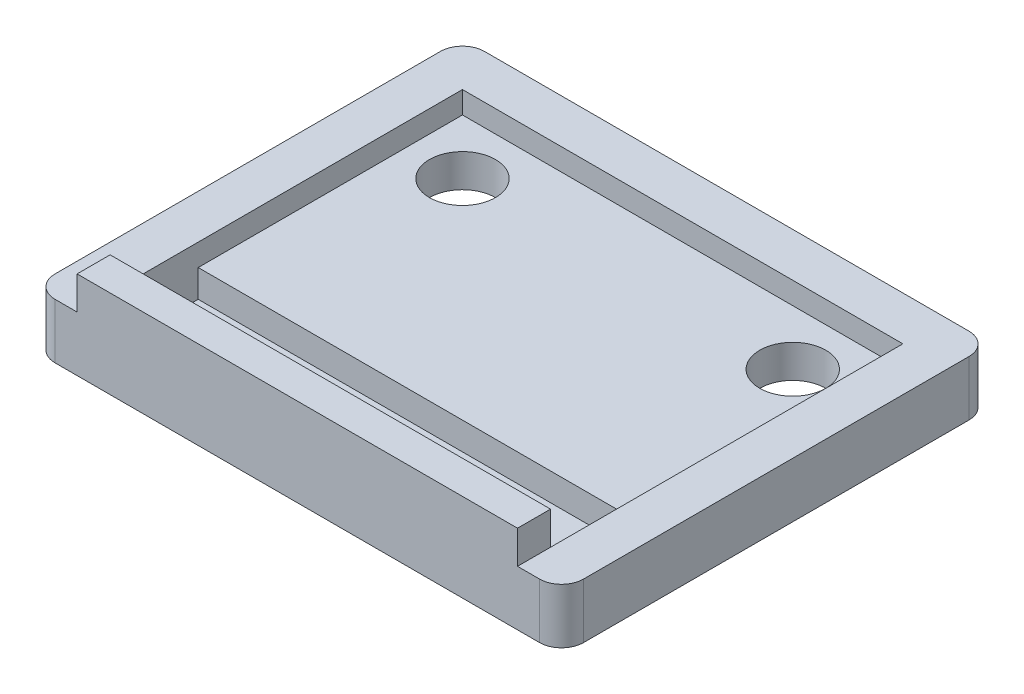
ISO-10303-21;
HEADER;
FILE_DESCRIPTION(('STEP AP214'),'2;1');
FILE_NAME('part.step','',(''),(''),'','','');
FILE_SCHEMA(('AUTOMOTIVE_DESIGN { 1 0 10303 214 1 1 1 1 }'));
ENDSEC;
DATA;
#1=APPLICATION_CONTEXT('core data for automotive mechanical design processes');
#2=APPLICATION_PROTOCOL_DEFINITION('international standard','automotive_design',2000,#1);
#3=PRODUCT_CONTEXT('',#1,'mechanical');
#4=PRODUCT('Part','Part','',(#3));
#5=PRODUCT_RELATED_PRODUCT_CATEGORY('part','',(#4));
#6=PRODUCT_DEFINITION_FORMATION('','',#4);
#7=PRODUCT_DEFINITION_CONTEXT('part definition',#1,'design');
#8=PRODUCT_DEFINITION('design','',#6,#7);
#9=PRODUCT_DEFINITION_SHAPE('','',#8);
#10=(LENGTH_UNIT() NAMED_UNIT(*) SI_UNIT(.MILLI.,.METRE.));
#11=(NAMED_UNIT(*) PLANE_ANGLE_UNIT() SI_UNIT($,.RADIAN.));
#12=(NAMED_UNIT(*) SI_UNIT($,.STERADIAN.) SOLID_ANGLE_UNIT());
#13=UNCERTAINTY_MEASURE_WITH_UNIT(LENGTH_MEASURE(1.E-05),#10,'distance_accuracy_value','');
#14=(GEOMETRIC_REPRESENTATION_CONTEXT(3) GLOBAL_UNCERTAINTY_ASSIGNED_CONTEXT((#13)) GLOBAL_UNIT_ASSIGNED_CONTEXT((#10,
#11,#12)) REPRESENTATION_CONTEXT('',''));
#15=CARTESIAN_POINT('',(0.,0.,0.));
#16=DIRECTION('',(0.,0.,1.));
#17=DIRECTION('',(1.,0.,0.));
#18=AXIS2_PLACEMENT_3D('',#15,#16,#17);
#19=CARTESIAN_POINT('',(22.,4.,0.));
#20=DIRECTION('',(1.,0.,0.));
#21=DIRECTION('',(0.,0.,-1.));
#22=AXIS2_PLACEMENT_3D('',#19,#20,#21);
#23=PLANE('',#22);
#24=DIRECTION('',(0.,0.,-1.));
#25=VECTOR('',#24,1.);
#26=CARTESIAN_POINT('',(22.,2.5,0.));
#27=LINE('',#26,#25);
#28=CARTESIAN_POINT('',(22.,2.5,0.));
#29=VERTEX_POINT('',#28);
#30=CARTESIAN_POINT('',(22.,2.5,-1.5));
#31=VERTEX_POINT('',#30);
#32=EDGE_CURVE('E220',#29,#31,#27,.T.);
#33=ORIENTED_EDGE('',*,*,#32,.T.);
#34=DIRECTION('',(0.,-1.,0.));
#35=VECTOR('',#34,1.);
#36=CARTESIAN_POINT('',(22.,4.,-1.5));
#37=LINE('',#36,#35);
#38=CARTESIAN_POINT('',(22.,4.,-1.5));
#39=VERTEX_POINT('',#38);
#40=EDGE_CURVE('E11',#39,#31,#37,.T.);
#41=ORIENTED_EDGE('',*,*,#40,.F.);
#42=DIRECTION('',(0.,0.,1.));
#43=VECTOR('',#42,1.);
#44=CARTESIAN_POINT('',(22.,4.,0.));
#45=LINE('',#44,#43);
#46=CARTESIAN_POINT('',(22.,4.,0.));
#47=VERTEX_POINT('',#46);
#48=EDGE_CURVE('E280',#39,#47,#45,.T.);
#49=ORIENTED_EDGE('',*,*,#48,.T.);
#50=DIRECTION('',(0.,-1.,0.));
#51=VECTOR('',#50,1.);
#52=CARTESIAN_POINT('',(22.,4.,0.));
#53=LINE('',#52,#51);
#54=EDGE_CURVE('E290',#47,#29,#53,.T.);
#55=ORIENTED_EDGE('',*,*,#54,.T.);
#56=EDGE_LOOP('',(#33,#41,#49,#55));
#57=FACE_BOUND('',#56,.T.);
#58=ADVANCED_FACE('F37',(#57),#23,.T.);
#59=CARTESIAN_POINT('',(0.,4.,-1.5));
#60=DIRECTION('',(0.,0.,-1.));
#61=DIRECTION('',(-1.,0.,0.));
#62=AXIS2_PLACEMENT_3D('',#59,#60,#61);
#63=PLANE('',#62);
#64=DIRECTION('',(1.,0.,0.));
#65=VECTOR('',#64,1.);
#66=CARTESIAN_POINT('',(0.,0.25,-1.5));
#67=LINE('',#66,#65);
#68=CARTESIAN_POINT('',(2.,0.25,-1.5));
#69=VERTEX_POINT('',#68);
#70=CARTESIAN_POINT('',(22.,0.25,-1.5));
#71=VERTEX_POINT('',#70);
#72=EDGE_CURVE('E171',#69,#71,#67,.T.);
#73=ORIENTED_EDGE('',*,*,#72,.F.);
#74=DIRECTION('',(0.,-1.,0.));
#75=VECTOR('',#74,1.);
#76=CARTESIAN_POINT('',(2.,4.,-1.5));
#77=LINE('',#76,#75);
#78=CARTESIAN_POINT('',(2.,2.5,-1.5));
#79=VERTEX_POINT('',#78);
#80=EDGE_CURVE('E277',#79,#69,#77,.T.);
#81=ORIENTED_EDGE('',*,*,#80,.F.);
#82=DIRECTION('',(0.,-1.,0.));
#83=VECTOR('',#82,1.);
#84=CARTESIAN_POINT('',(2.,4.,-1.5));
#85=LINE('',#84,#83);
#86=CARTESIAN_POINT('',(2.,4.,-1.5));
#87=VERTEX_POINT('',#86);
#88=EDGE_CURVE('E44',#87,#79,#85,.T.);
#89=ORIENTED_EDGE('',*,*,#88,.F.);
#90=DIRECTION('',(1.,0.,0.));
#91=VECTOR('',#90,1.);
#92=CARTESIAN_POINT('',(0.,4.,-1.5));
#93=LINE('',#92,#91);
#94=EDGE_CURVE('E283',#87,#39,#93,.T.);
#95=ORIENTED_EDGE('',*,*,#94,.T.);
#96=ORIENTED_EDGE('',*,*,#40,.T.);
#97=DIRECTION('',(0.,1.,0.));
#98=VECTOR('',#97,1.);
#99=CARTESIAN_POINT('',(22.,4.,-1.5));
#100=LINE('',#99,#98);
#101=EDGE_CURVE('E275',#71,#31,#100,.T.);
#102=ORIENTED_EDGE('',*,*,#101,.F.);
#103=EDGE_LOOP('',(#73,#81,#89,#95,#96,#102));
#104=FACE_BOUND('',#103,.T.);
#105=ADVANCED_FACE('F322',(#104),#63,.T.);
#106=CARTESIAN_POINT('',(2.,4.,0.));
#107=DIRECTION('',(1.,0.,0.));
#108=DIRECTION('',(0.,0.,-1.));
#109=AXIS2_PLACEMENT_3D('',#106,#107,#108);
#110=PLANE('',#109);
#111=ORIENTED_EDGE('',*,*,#88,.T.);
#112=DIRECTION('',(0.,0.,1.));
#113=VECTOR('',#112,1.);
#114=CARTESIAN_POINT('',(2.,2.5,0.));
#115=LINE('',#114,#113);
#116=CARTESIAN_POINT('',(2.,2.5,0.));
#117=VERTEX_POINT('',#116);
#118=EDGE_CURVE('E211',#79,#117,#115,.T.);
#119=ORIENTED_EDGE('',*,*,#118,.T.);
#120=DIRECTION('',(0.,-1.,0.));
#121=VECTOR('',#120,1.);
#122=CARTESIAN_POINT('',(2.,4.,0.));
#123=LINE('',#122,#121);
#124=CARTESIAN_POINT('',(2.,4.,0.));
#125=VERTEX_POINT('',#124);
#126=EDGE_CURVE('E294',#125,#117,#123,.T.);
#127=ORIENTED_EDGE('',*,*,#126,.F.);
#128=DIRECTION('',(0.,0.,1.));
#129=VECTOR('',#128,1.);
#130=CARTESIAN_POINT('',(2.,4.,0.));
#131=LINE('',#130,#129);
#132=EDGE_CURVE('E286',#87,#125,#131,.T.);
#133=ORIENTED_EDGE('',*,*,#132,.F.);
#134=EDGE_LOOP('',(#111,#119,#127,#133));
#135=FACE_BOUND('',#134,.T.);
#136=ADVANCED_FACE('F300',(#135),#110,.F.);
#137=CARTESIAN_POINT('',(0.,4.,0.));
#138=DIRECTION('',(0.,0.,-1.));
#139=DIRECTION('',(-1.,0.,0.));
#140=AXIS2_PLACEMENT_3D('',#137,#138,#139);
#141=PLANE('',#140);
#142=DIRECTION('',(1.,0.,0.));
#143=VECTOR('',#142,1.);
#144=CARTESIAN_POINT('',(0.,0.,0.));
#145=LINE('',#144,#143);
#146=CARTESIAN_POINT('',(1.00000000000001,0.,0.));
#147=VERTEX_POINT('',#146);
#148=CARTESIAN_POINT('',(23.,0.,0.));
#149=VERTEX_POINT('',#148);
#150=EDGE_CURVE('E279',#147,#149,#145,.T.);
#151=ORIENTED_EDGE('',*,*,#150,.T.);
#152=DIRECTION('',(0.,-1.,0.));
#153=VECTOR('',#152,1.);
#154=CARTESIAN_POINT('',(23.,2.5,0.));
#155=LINE('',#154,#153);
#156=CARTESIAN_POINT('',(23.,2.5,0.));
#157=VERTEX_POINT('',#156);
#158=EDGE_CURVE('E260',#157,#149,#155,.T.);
#159=ORIENTED_EDGE('',*,*,#158,.F.);
#160=DIRECTION('',(1.,0.,0.));
#161=VECTOR('',#160,1.);
#162=CARTESIAN_POINT('',(0.,2.5,0.));
#163=LINE('',#162,#161);
#164=EDGE_CURVE('E212',#29,#157,#163,.T.);
#165=ORIENTED_EDGE('',*,*,#164,.F.);
#166=ORIENTED_EDGE('',*,*,#54,.F.);
#167=DIRECTION('',(1.,0.,0.));
#168=VECTOR('',#167,1.);
#169=CARTESIAN_POINT('',(0.,4.,0.));
#170=LINE('',#169,#168);
#171=EDGE_CURVE('E288',#125,#47,#170,.T.);
#172=ORIENTED_EDGE('',*,*,#171,.F.);
#173=ORIENTED_EDGE('',*,*,#126,.T.);
#174=CARTESIAN_POINT('',(1.00000000000001,2.5,0.));
#175=VERTEX_POINT('',#174);
#176=EDGE_CURVE('E208',#175,#117,#163,.T.);
#177=ORIENTED_EDGE('',*,*,#176,.F.);
#178=DIRECTION('',(0.,-1.,0.));
#179=VECTOR('',#178,1.);
#180=CARTESIAN_POINT('',(1.00000000000001,2.5,0.));
#181=LINE('',#180,#179);
#182=EDGE_CURVE('E268',#175,#147,#181,.T.);
#183=ORIENTED_EDGE('',*,*,#182,.T.);
#184=EDGE_LOOP('',(#151,#159,#165,#166,#172,#173,#177,#183));
#185=FACE_BOUND('',#184,.T.);
#186=ADVANCED_FACE('F327',(#185),#141,.F.);
#187=CARTESIAN_POINT('',(0.,4.,0.));
#188=DIRECTION('',(0.,1.,0.));
#189=DIRECTION('',(0.,0.,1.));
#190=AXIS2_PLACEMENT_3D('',#187,#188,#189);
#191=PLANE('',#190);
#192=ORIENTED_EDGE('',*,*,#48,.F.);
#193=ORIENTED_EDGE('',*,*,#94,.F.);
#194=ORIENTED_EDGE('',*,*,#132,.T.);
#195=ORIENTED_EDGE('',*,*,#171,.T.);
#196=EDGE_LOOP('',(#192,#193,#194,#195));
#197=FACE_BOUND('',#196,.T.);
#198=ADVANCED_FACE('F324',(#197),#191,.T.);
#199=CARTESIAN_POINT('',(0.,0.,0.));
#200=DIRECTION('',(0.,1.,0.));
#201=DIRECTION('',(0.,0.,1.));
#202=AXIS2_PLACEMENT_3D('',#199,#200,#201);
#203=PLANE('',#202);
#204=ORIENTED_EDGE('',*,*,#150,.F.);
#205=CARTESIAN_POINT('',(1.,0.,-1.));
#206=DIRECTION('',(0.,1.,0.));
#207=DIRECTION('',(0.,0.,1.));
#208=AXIS2_PLACEMENT_3D('',#205,#206,#207);
#209=CIRCLE('',#208,1.);
#210=CARTESIAN_POINT('',(0.,0.,-1.00000000000001));
#211=VERTEX_POINT('',#210);
#212=EDGE_CURVE('E239',#147,#211,#209,.F.);
#213=ORIENTED_EDGE('',*,*,#212,.T.);
#214=DIRECTION('',(0.,0.,-1.));
#215=VECTOR('',#214,1.);
#216=CARTESIAN_POINT('',(0.,0.,0.));
#217=LINE('',#216,#215);
#218=CARTESIAN_POINT('',(0.,0.,-18.5));
#219=VERTEX_POINT('',#218);
#220=EDGE_CURVE('E236',#211,#219,#217,.T.);
#221=ORIENTED_EDGE('',*,*,#220,.T.);
#222=CARTESIAN_POINT('',(1.,0.,-18.5));
#223=DIRECTION('',(0.,1.,0.));
#224=DIRECTION('',(0.,0.,1.));
#225=AXIS2_PLACEMENT_3D('',#222,#223,#224);
#226=CIRCLE('',#225,1.);
#227=CARTESIAN_POINT('',(1.00000000000001,0.,-19.5));
#228=VERTEX_POINT('',#227);
#229=EDGE_CURVE('E165',#219,#228,#226,.F.);
#230=ORIENTED_EDGE('',*,*,#229,.T.);
#231=DIRECTION('',(1.,0.,0.));
#232=VECTOR('',#231,1.);
#233=CARTESIAN_POINT('',(0.,0.,-19.5));
#234=LINE('',#233,#232);
#235=CARTESIAN_POINT('',(23.,0.,-19.5));
#236=VERTEX_POINT('',#235);
#237=EDGE_CURVE('E202',#228,#236,#234,.T.);
#238=ORIENTED_EDGE('',*,*,#237,.T.);
#239=CARTESIAN_POINT('',(23.,0.,-18.5));
#240=DIRECTION('',(0.,1.,0.));
#241=DIRECTION('',(0.,0.,1.));
#242=AXIS2_PLACEMENT_3D('',#239,#240,#241);
#243=CIRCLE('',#242,1.);
#244=CARTESIAN_POINT('',(24.,0.,-18.5));
#245=VERTEX_POINT('',#244);
#246=EDGE_CURVE('E247',#236,#245,#243,.F.);
#247=ORIENTED_EDGE('',*,*,#246,.T.);
#248=DIRECTION('',(0.,0.,-1.));
#249=VECTOR('',#248,1.);
#250=CARTESIAN_POINT('',(24.,0.,0.));
#251=LINE('',#250,#249);
#252=CARTESIAN_POINT('',(24.,0.,-1.00000000000001));
#253=VERTEX_POINT('',#252);
#254=EDGE_CURVE('E244',#253,#245,#251,.T.);
#255=ORIENTED_EDGE('',*,*,#254,.F.);
#256=CARTESIAN_POINT('',(23.,0.,-1.));
#257=DIRECTION('',(0.,1.,0.));
#258=DIRECTION('',(0.,0.,1.));
#259=AXIS2_PLACEMENT_3D('',#256,#257,#258);
#260=CIRCLE('',#259,1.);
#261=EDGE_CURVE('E242',#149,#253,#260,.T.);
#262=ORIENTED_EDGE('',*,*,#261,.F.);
#263=EDGE_LOOP('',(#204,#213,#221,#230,#238,#247,#255,#262));
#264=FACE_BOUND('',#263,.T.);
#265=CARTESIAN_POINT('',(4.5,0.,-15.));
#266=DIRECTION('',(0.,1.,0.));
#267=DIRECTION('',(0.,0.,1.));
#268=AXIS2_PLACEMENT_3D('',#265,#266,#267);
#269=CIRCLE('',#268,1.5);
#270=CARTESIAN_POINT('',(4.5,0.,-13.5));
#271=VERTEX_POINT('',#270);
#272=EDGE_CURVE('E172',#271,#271,#269,.T.);
#273=ORIENTED_EDGE('',*,*,#272,.T.);
#274=EDGE_LOOP('',(#273));
#275=FACE_BOUND('',#274,.T.);
#276=CARTESIAN_POINT('',(19.5,0.,-15.));
#277=DIRECTION('',(0.,1.,0.));
#278=DIRECTION('',(0.,0.,1.));
#279=AXIS2_PLACEMENT_3D('',#276,#277,#278);
#280=CIRCLE('',#279,1.5);
#281=CARTESIAN_POINT('',(19.5,0.,-13.5));
#282=VERTEX_POINT('',#281);
#283=EDGE_CURVE('E181',#282,#282,#280,.F.);
#284=ORIENTED_EDGE('',*,*,#283,.F.);
#285=EDGE_LOOP('',(#284));
#286=FACE_BOUND('',#285,.T.);
#287=ADVANCED_FACE('F358',(#264,#275,#286),#203,.F.);
#288=CARTESIAN_POINT('',(1.,2.5,-18.5));
#289=DIRECTION('',(0.,-1.,0.));
#290=DIRECTION('',(0.,0.,-1.));
#291=AXIS2_PLACEMENT_3D('',#288,#289,#290);
#292=CYLINDRICAL_SURFACE('',#291,1.);
#293=ORIENTED_EDGE('',*,*,#229,.F.);
#294=DIRECTION('',(0.,-1.,0.));
#295=VECTOR('',#294,1.);
#296=CARTESIAN_POINT('',(0.,2.5,-18.5));
#297=LINE('',#296,#295);
#298=CARTESIAN_POINT('',(0.,2.5,-18.5));
#299=VERTEX_POINT('',#298);
#300=EDGE_CURVE('E273',#299,#219,#297,.T.);
#301=ORIENTED_EDGE('',*,*,#300,.F.);
#302=CARTESIAN_POINT('',(1.,2.5,-18.5));
#303=DIRECTION('',(0.,1.,0.));
#304=DIRECTION('',(0.,0.,1.));
#305=AXIS2_PLACEMENT_3D('',#302,#303,#304);
#306=CIRCLE('',#305,1.);
#307=CARTESIAN_POINT('',(1.00000000000001,2.5,-19.5));
#308=VERTEX_POINT('',#307);
#309=EDGE_CURVE('E198',#299,#308,#306,.F.);
#310=ORIENTED_EDGE('',*,*,#309,.T.);
#311=DIRECTION('',(0.,-1.,0.));
#312=VECTOR('',#311,1.);
#313=CARTESIAN_POINT('',(1.00000000000001,2.5,-19.5));
#314=LINE('',#313,#312);
#315=EDGE_CURVE('E233',#308,#228,#314,.T.);
#316=ORIENTED_EDGE('',*,*,#315,.T.);
#317=EDGE_LOOP('',(#293,#301,#310,#316));
#318=FACE_BOUND('',#317,.T.);
#319=ADVANCED_FACE('F349',(#318),#292,.T.);
#320=CARTESIAN_POINT('',(0.,2.5,0.));
#321=DIRECTION('',(-1.,0.,0.));
#322=DIRECTION('',(0.,0.,1.));
#323=AXIS2_PLACEMENT_3D('',#320,#321,#322);
#324=PLANE('',#323);
#325=ORIENTED_EDGE('',*,*,#220,.F.);
#326=DIRECTION('',(0.,-1.,0.));
#327=VECTOR('',#326,1.);
#328=CARTESIAN_POINT('',(0.,2.5,-1.00000000000001));
#329=LINE('',#328,#327);
#330=CARTESIAN_POINT('',(0.,2.5,-1.00000000000001));
#331=VERTEX_POINT('',#330);
#332=EDGE_CURVE('E271',#331,#211,#329,.T.);
#333=ORIENTED_EDGE('',*,*,#332,.F.);
#334=DIRECTION('',(0.,0.,-1.));
#335=VECTOR('',#334,1.);
#336=CARTESIAN_POINT('',(0.,2.5,0.));
#337=LINE('',#336,#335);
#338=EDGE_CURVE('E201',#331,#299,#337,.T.);
#339=ORIENTED_EDGE('',*,*,#338,.T.);
#340=ORIENTED_EDGE('',*,*,#300,.T.);
#341=EDGE_LOOP('',(#325,#333,#339,#340));
#342=FACE_BOUND('',#341,.T.);
#343=ADVANCED_FACE('F353',(#342),#324,.T.);
#344=CARTESIAN_POINT('',(1.,2.5,-1.));
#345=DIRECTION('',(0.,-1.,0.));
#346=DIRECTION('',(0.,0.,-1.));
#347=AXIS2_PLACEMENT_3D('',#344,#345,#346);
#348=CYLINDRICAL_SURFACE('',#347,1.);
#349=ORIENTED_EDGE('',*,*,#212,.F.);
#350=ORIENTED_EDGE('',*,*,#182,.F.);
#351=CARTESIAN_POINT('',(1.,2.5,-1.));
#352=DIRECTION('',(0.,1.,0.));
#353=DIRECTION('',(0.,0.,1.));
#354=AXIS2_PLACEMENT_3D('',#351,#352,#353);
#355=CIRCLE('',#354,1.);
#356=EDGE_CURVE('E205',#175,#331,#355,.F.);
#357=ORIENTED_EDGE('',*,*,#356,.T.);
#358=ORIENTED_EDGE('',*,*,#332,.T.);
#359=EDGE_LOOP('',(#349,#350,#357,#358));
#360=FACE_BOUND('',#359,.T.);
#361=ADVANCED_FACE('F356',(#360),#348,.T.);
#362=CARTESIAN_POINT('',(2.,2.5,0.));
#363=DIRECTION('',(1.,0.,0.));
#364=DIRECTION('',(0.,0.,-1.));
#365=AXIS2_PLACEMENT_3D('',#362,#363,#364);
#366=PLANE('',#365);
#367=DIRECTION('',(0.,0.,-1.));
#368=VECTOR('',#367,1.);
#369=CARTESIAN_POINT('',(2.,1.5,0.));
#370=LINE('',#369,#368);
#371=CARTESIAN_POINT('',(2.,1.5,-5.5));
#372=VERTEX_POINT('',#371);
#373=CARTESIAN_POINT('',(2.,1.5,-17.5));
#374=VERTEX_POINT('',#373);
#375=EDGE_CURVE('E185',#372,#374,#370,.T.);
#376=ORIENTED_EDGE('',*,*,#375,.T.);
#377=DIRECTION('',(0.,-1.,0.));
#378=VECTOR('',#377,1.);
#379=CARTESIAN_POINT('',(2.,2.5,-17.5));
#380=LINE('',#379,#378);
#381=CARTESIAN_POINT('',(2.,2.5,-17.5));
#382=VERTEX_POINT('',#381);
#383=EDGE_CURVE('E265',#382,#374,#380,.T.);
#384=ORIENTED_EDGE('',*,*,#383,.F.);
#385=EDGE_CURVE('E213',#382,#79,#115,.T.);
#386=ORIENTED_EDGE('',*,*,#385,.T.);
#387=ORIENTED_EDGE('',*,*,#80,.T.);
#388=DIRECTION('',(0.,0.,-1.));
#389=VECTOR('',#388,1.);
#390=CARTESIAN_POINT('',(2.,0.25,0.));
#391=LINE('',#390,#389);
#392=CARTESIAN_POINT('',(2.,0.25,-5.5));
#393=VERTEX_POINT('',#392);
#394=EDGE_CURVE('E56',#69,#393,#391,.T.);
#395=ORIENTED_EDGE('',*,*,#394,.T.);
#396=DIRECTION('',(0.,-1.,0.));
#397=VECTOR('',#396,1.);
#398=CARTESIAN_POINT('',(2.,1.5,-5.5));
#399=LINE('',#398,#397);
#400=EDGE_CURVE('E51',#372,#393,#399,.T.);
#401=ORIENTED_EDGE('',*,*,#400,.F.);
#402=EDGE_LOOP('',(#376,#384,#386,#387,#395,#401));
#403=FACE_BOUND('',#402,.T.);
#404=ADVANCED_FACE('F310',(#403),#366,.T.);
#405=CARTESIAN_POINT('',(0.,2.5,-17.5));
#406=DIRECTION('',(0.,0.,-1.));
#407=DIRECTION('',(-1.,0.,0.));
#408=AXIS2_PLACEMENT_3D('',#405,#406,#407);
#409=PLANE('',#408);
#410=ORIENTED_EDGE('',*,*,#383,.T.);
#411=DIRECTION('',(1.,0.,0.));
#412=VECTOR('',#411,1.);
#413=CARTESIAN_POINT('',(0.,1.5,-17.5));
#414=LINE('',#413,#412);
#415=CARTESIAN_POINT('',(22.,1.5,-17.5));
#416=VERTEX_POINT('',#415);
#417=EDGE_CURVE('E183',#374,#416,#414,.T.);
#418=ORIENTED_EDGE('',*,*,#417,.T.);
#419=DIRECTION('',(0.,-1.,0.));
#420=VECTOR('',#419,1.);
#421=CARTESIAN_POINT('',(22.,2.5,-17.5));
#422=LINE('',#421,#420);
#423=CARTESIAN_POINT('',(22.,2.5,-17.5));
#424=VERTEX_POINT('',#423);
#425=EDGE_CURVE('E263',#424,#416,#422,.T.);
#426=ORIENTED_EDGE('',*,*,#425,.F.);
#427=DIRECTION('',(1.,0.,0.));
#428=VECTOR('',#427,1.);
#429=CARTESIAN_POINT('',(0.,2.5,-17.5));
#430=LINE('',#429,#428);
#431=EDGE_CURVE('E216',#382,#424,#430,.T.);
#432=ORIENTED_EDGE('',*,*,#431,.F.);
#433=EDGE_LOOP('',(#410,#418,#426,#432));
#434=FACE_BOUND('',#433,.T.);
#435=ADVANCED_FACE('F316',(#434),#409,.F.);
#436=CARTESIAN_POINT('',(22.,2.5,0.));
#437=DIRECTION('',(-1.,0.,0.));
#438=DIRECTION('',(0.,0.,1.));
#439=AXIS2_PLACEMENT_3D('',#436,#437,#438);
#440=PLANE('',#439);
#441=DIRECTION('',(0.,0.,-1.));
#442=VECTOR('',#441,1.);
#443=CARTESIAN_POINT('',(22.,1.5,0.));
#444=LINE('',#443,#442);
#445=CARTESIAN_POINT('',(22.,1.5,-5.5));
#446=VERTEX_POINT('',#445);
#447=EDGE_CURVE('E161',#446,#416,#444,.T.);
#448=ORIENTED_EDGE('',*,*,#447,.F.);
#449=DIRECTION('',(0.,-1.,0.));
#450=VECTOR('',#449,1.);
#451=CARTESIAN_POINT('',(22.,1.5,-5.5));
#452=LINE('',#451,#450);
#453=CARTESIAN_POINT('',(22.,0.25,-5.5));
#454=VERTEX_POINT('',#453);
#455=EDGE_CURVE('E154',#446,#454,#452,.T.);
#456=ORIENTED_EDGE('',*,*,#455,.T.);
#457=DIRECTION('',(0.,0.,-1.));
#458=VECTOR('',#457,1.);
#459=CARTESIAN_POINT('',(22.,0.25,0.));
#460=LINE('',#459,#458);
#461=EDGE_CURVE('E157',#71,#454,#460,.T.);
#462=ORIENTED_EDGE('',*,*,#461,.F.);
#463=ORIENTED_EDGE('',*,*,#101,.T.);
#464=EDGE_CURVE('E219',#31,#424,#27,.T.);
#465=ORIENTED_EDGE('',*,*,#464,.T.);
#466=ORIENTED_EDGE('',*,*,#425,.T.);
#467=EDGE_LOOP('',(#448,#456,#462,#463,#465,#466));
#468=FACE_BOUND('',#467,.T.);
#469=ADVANCED_FACE('F156',(#468),#440,.T.);
#470=CARTESIAN_POINT('',(23.,2.5,-1.));
#471=DIRECTION('',(0.,-1.,0.));
#472=DIRECTION('',(0.,0.,-1.));
#473=AXIS2_PLACEMENT_3D('',#470,#471,#472);
#474=CYLINDRICAL_SURFACE('',#473,1.);
#475=ORIENTED_EDGE('',*,*,#261,.T.);
#476=DIRECTION('',(0.,-1.,0.));
#477=VECTOR('',#476,1.);
#478=CARTESIAN_POINT('',(24.,2.5,-1.00000000000001));
#479=LINE('',#478,#477);
#480=CARTESIAN_POINT('',(24.,2.5,-1.00000000000001));
#481=VERTEX_POINT('',#480);
#482=EDGE_CURVE('E257',#481,#253,#479,.T.);
#483=ORIENTED_EDGE('',*,*,#482,.F.);
#484=CARTESIAN_POINT('',(23.,2.5,-1.));
#485=DIRECTION('',(0.,1.,0.));
#486=DIRECTION('',(0.,0.,1.));
#487=AXIS2_PLACEMENT_3D('',#484,#485,#486);
#488=CIRCLE('',#487,1.);
#489=EDGE_CURVE('E223',#157,#481,#488,.T.);
#490=ORIENTED_EDGE('',*,*,#489,.F.);
#491=ORIENTED_EDGE('',*,*,#158,.T.);
#492=EDGE_LOOP('',(#475,#483,#490,#491));
#493=FACE_BOUND('',#492,.T.);
#494=ADVANCED_FACE('F335',(#493),#474,.T.);
#495=CARTESIAN_POINT('',(24.,2.5,0.));
#496=DIRECTION('',(-1.,0.,0.));
#497=DIRECTION('',(0.,0.,1.));
#498=AXIS2_PLACEMENT_3D('',#495,#496,#497);
#499=PLANE('',#498);
#500=ORIENTED_EDGE('',*,*,#254,.T.);
#501=DIRECTION('',(0.,-1.,0.));
#502=VECTOR('',#501,1.);
#503=CARTESIAN_POINT('',(24.,2.5,-18.5));
#504=LINE('',#503,#502);
#505=CARTESIAN_POINT('',(24.,2.5,-18.5));
#506=VERTEX_POINT('',#505);
#507=EDGE_CURVE('E255',#506,#245,#504,.T.);
#508=ORIENTED_EDGE('',*,*,#507,.F.);
#509=DIRECTION('',(0.,0.,-1.));
#510=VECTOR('',#509,1.);
#511=CARTESIAN_POINT('',(24.,2.5,0.));
#512=LINE('',#511,#510);
#513=EDGE_CURVE('E225',#481,#506,#512,.T.);
#514=ORIENTED_EDGE('',*,*,#513,.F.);
#515=ORIENTED_EDGE('',*,*,#482,.T.);
#516=EDGE_LOOP('',(#500,#508,#514,#515));
#517=FACE_BOUND('',#516,.T.);
#518=ADVANCED_FACE('F339',(#517),#499,.F.);
#519=CARTESIAN_POINT('',(23.,2.5,-18.5));
#520=DIRECTION('',(0.,-1.,0.));
#521=DIRECTION('',(0.,0.,-1.));
#522=AXIS2_PLACEMENT_3D('',#519,#520,#521);
#523=CYLINDRICAL_SURFACE('',#522,1.);
#524=ORIENTED_EDGE('',*,*,#246,.F.);
#525=DIRECTION('',(0.,-1.,0.));
#526=VECTOR('',#525,1.);
#527=CARTESIAN_POINT('',(23.,2.5,-19.5));
#528=LINE('',#527,#526);
#529=CARTESIAN_POINT('',(23.,2.5,-19.5));
#530=VERTEX_POINT('',#529);
#531=EDGE_CURVE('E253',#530,#236,#528,.T.);
#532=ORIENTED_EDGE('',*,*,#531,.F.);
#533=CARTESIAN_POINT('',(23.,2.5,-18.5));
#534=DIRECTION('',(0.,1.,0.));
#535=DIRECTION('',(0.,0.,1.));
#536=AXIS2_PLACEMENT_3D('',#533,#534,#535);
#537=CIRCLE('',#536,1.);
#538=EDGE_CURVE('E227',#530,#506,#537,.F.);
#539=ORIENTED_EDGE('',*,*,#538,.T.);
#540=ORIENTED_EDGE('',*,*,#507,.T.);
#541=EDGE_LOOP('',(#524,#532,#539,#540));
#542=FACE_BOUND('',#541,.T.);
#543=ADVANCED_FACE('F342',(#542),#523,.T.);
#544=CARTESIAN_POINT('',(0.,2.5,-19.5));
#545=DIRECTION('',(0.,0.,-1.));
#546=DIRECTION('',(-1.,0.,0.));
#547=AXIS2_PLACEMENT_3D('',#544,#545,#546);
#548=PLANE('',#547);
#549=ORIENTED_EDGE('',*,*,#237,.F.);
#550=ORIENTED_EDGE('',*,*,#315,.F.);
#551=DIRECTION('',(1.,0.,0.));
#552=VECTOR('',#551,1.);
#553=CARTESIAN_POINT('',(0.,2.5,-19.5));
#554=LINE('',#553,#552);
#555=EDGE_CURVE('E230',#308,#530,#554,.T.);
#556=ORIENTED_EDGE('',*,*,#555,.T.);
#557=ORIENTED_EDGE('',*,*,#531,.T.);
#558=EDGE_LOOP('',(#549,#550,#556,#557));
#559=FACE_BOUND('',#558,.T.);
#560=ADVANCED_FACE('F346',(#559),#548,.T.);
#561=CARTESIAN_POINT('',(0.,2.5,0.));
#562=DIRECTION('',(0.,1.,0.));
#563=DIRECTION('',(0.,0.,1.));
#564=AXIS2_PLACEMENT_3D('',#561,#562,#563);
#565=PLANE('',#564);
#566=ORIENTED_EDGE('',*,*,#309,.F.);
#567=ORIENTED_EDGE('',*,*,#338,.F.);
#568=ORIENTED_EDGE('',*,*,#356,.F.);
#569=ORIENTED_EDGE('',*,*,#176,.T.);
#570=ORIENTED_EDGE('',*,*,#118,.F.);
#571=ORIENTED_EDGE('',*,*,#385,.F.);
#572=ORIENTED_EDGE('',*,*,#431,.T.);
#573=ORIENTED_EDGE('',*,*,#464,.F.);
#574=ORIENTED_EDGE('',*,*,#32,.F.);
#575=ORIENTED_EDGE('',*,*,#164,.T.);
#576=ORIENTED_EDGE('',*,*,#489,.T.);
#577=ORIENTED_EDGE('',*,*,#513,.T.);
#578=ORIENTED_EDGE('',*,*,#538,.F.);
#579=ORIENTED_EDGE('',*,*,#555,.F.);
#580=EDGE_LOOP('',(#566,#567,#568,#569,#570,#571,#572,#573,#574,#575,#576,#577,#578,#579));
#581=FACE_BOUND('',#580,.T.);
#582=ADVANCED_FACE('F307',(#581),#565,.T.);
#583=CARTESIAN_POINT('',(0.,1.5,-5.5));
#584=DIRECTION('',(0.,0.,-1.));
#585=DIRECTION('',(-1.,0.,0.));
#586=AXIS2_PLACEMENT_3D('',#583,#584,#585);
#587=PLANE('',#586);
#588=ORIENTED_EDGE('',*,*,#400,.T.);
#589=DIRECTION('',(1.,0.,0.));
#590=VECTOR('',#589,1.);
#591=CARTESIAN_POINT('',(0.,0.25,-5.5));
#592=LINE('',#591,#590);
#593=EDGE_CURVE('E170',#393,#454,#592,.T.);
#594=ORIENTED_EDGE('',*,*,#593,.T.);
#595=ORIENTED_EDGE('',*,*,#455,.F.);
#596=DIRECTION('',(1.,0.,0.));
#597=VECTOR('',#596,1.);
#598=CARTESIAN_POINT('',(0.,1.5,-5.5));
#599=LINE('',#598,#597);
#600=EDGE_CURVE('E179',#372,#446,#599,.T.);
#601=ORIENTED_EDGE('',*,*,#600,.F.);
#602=EDGE_LOOP('',(#588,#594,#595,#601));
#603=FACE_BOUND('',#602,.T.);
#604=ADVANCED_FACE('F174',(#603),#587,.F.);
#605=CARTESIAN_POINT('',(4.5,1.5,-15.));
#606=DIRECTION('',(0.,-1.,0.));
#607=DIRECTION('',(0.,0.,-1.));
#608=AXIS2_PLACEMENT_3D('',#605,#606,#607);
#609=CYLINDRICAL_SURFACE('',#608,1.5);
#610=CARTESIAN_POINT('',(4.5,1.5,-15.));
#611=DIRECTION('',(0.,1.,0.));
#612=DIRECTION('',(0.,0.,1.));
#613=AXIS2_PLACEMENT_3D('',#610,#611,#612);
#614=CIRCLE('',#613,1.5);
#615=CARTESIAN_POINT('',(4.5,1.5,-13.5));
#616=VERTEX_POINT('',#615);
#617=EDGE_CURVE('E187',#616,#616,#614,.T.);
#618=ORIENTED_EDGE('',*,*,#617,.T.);
#619=EDGE_LOOP('',(#618));
#620=FACE_BOUND('',#619,.T.);
#621=ORIENTED_EDGE('',*,*,#272,.F.);
#622=EDGE_LOOP('',(#621));
#623=FACE_BOUND('',#622,.T.);
#624=ADVANCED_FACE('F369',(#620,#623),#609,.F.);
#625=CARTESIAN_POINT('',(19.5,1.5,-15.));
#626=DIRECTION('',(0.,-1.,0.));
#627=DIRECTION('',(0.,0.,-1.));
#628=AXIS2_PLACEMENT_3D('',#625,#626,#627);
#629=CYLINDRICAL_SURFACE('',#628,1.5);
#630=CARTESIAN_POINT('',(19.5,1.5,-15.));
#631=DIRECTION('',(0.,1.,0.));
#632=DIRECTION('',(0.,0.,1.));
#633=AXIS2_PLACEMENT_3D('',#630,#631,#632);
#634=CIRCLE('',#633,1.5);
#635=CARTESIAN_POINT('',(19.5,1.5,-13.5));
#636=VERTEX_POINT('',#635);
#637=EDGE_CURVE('E190',#636,#636,#634,.F.);
#638=ORIENTED_EDGE('',*,*,#637,.F.);
#639=EDGE_LOOP('',(#638));
#640=FACE_BOUND('',#639,.T.);
#641=ORIENTED_EDGE('',*,*,#283,.T.);
#642=EDGE_LOOP('',(#641));
#643=FACE_BOUND('',#642,.T.);
#644=ADVANCED_FACE('F366',(#640,#643),#629,.F.);
#645=CARTESIAN_POINT('',(0.,1.5,0.));
#646=DIRECTION('',(0.,1.,0.));
#647=DIRECTION('',(0.,0.,1.));
#648=AXIS2_PLACEMENT_3D('',#645,#646,#647);
#649=PLANE('',#648);
#650=ORIENTED_EDGE('',*,*,#600,.T.);
#651=ORIENTED_EDGE('',*,*,#447,.T.);
#652=ORIENTED_EDGE('',*,*,#417,.F.);
#653=ORIENTED_EDGE('',*,*,#375,.F.);
#654=EDGE_LOOP('',(#650,#651,#652,#653));
#655=FACE_BOUND('',#654,.T.);
#656=ORIENTED_EDGE('',*,*,#617,.F.);
#657=EDGE_LOOP('',(#656));
#658=FACE_BOUND('',#657,.T.);
#659=ORIENTED_EDGE('',*,*,#637,.T.);
#660=EDGE_LOOP('',(#659));
#661=FACE_BOUND('',#660,.T.);
#662=ADVANCED_FACE('F368',(#655,#658,#661),#649,.T.);
#663=CARTESIAN_POINT('',(0.,0.25,0.));
#664=DIRECTION('',(0.,1.,0.));
#665=DIRECTION('',(0.,0.,1.));
#666=AXIS2_PLACEMENT_3D('',#663,#664,#665);
#667=PLANE('',#666);
#668=ORIENTED_EDGE('',*,*,#593,.F.);
#669=ORIENTED_EDGE('',*,*,#394,.F.);
#670=ORIENTED_EDGE('',*,*,#72,.T.);
#671=ORIENTED_EDGE('',*,*,#461,.T.);
#672=EDGE_LOOP('',(#668,#669,#670,#671));
#673=FACE_BOUND('',#672,.T.);
#674=ADVANCED_FACE('F169',(#673),#667,.T.);
#675=CLOSED_SHELL('',(#58,#105,#136,#186,#198,#287,#319,#343,#361,#404,#435,#469,#494,#518,#543,
#560,#582,#604,#624,#644,#662,#674));
#676=MANIFOLD_SOLID_BREP('B2',#675);
#677=ADVANCED_BREP_SHAPE_REPRESENTATION('',(#18,#676),#14);
#678=SHAPE_DEFINITION_REPRESENTATION(#9,#677);
ENDSEC;
END-ISO-10303-21;
